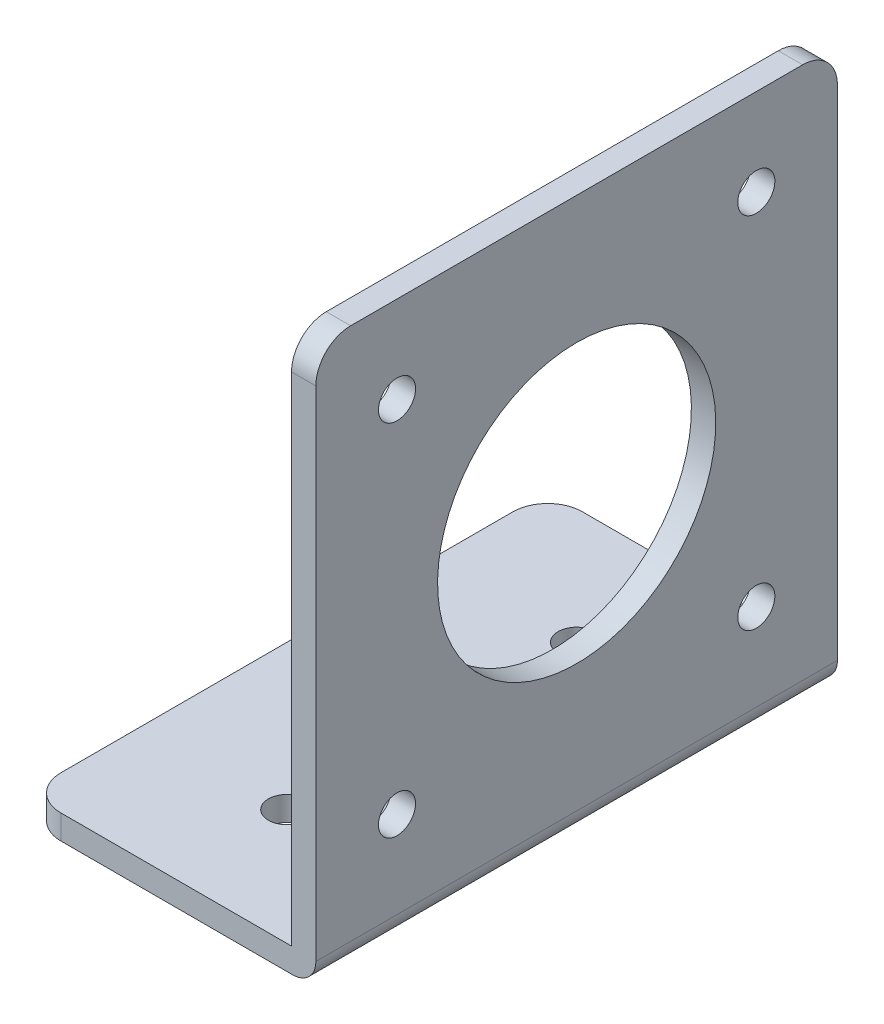
ISO-10303-21;
HEADER;
FILE_DESCRIPTION(('STEP AP214'),'2;1');
FILE_NAME('part.step','',(''),(''),'','','');
FILE_SCHEMA(('AUTOMOTIVE_DESIGN { 1 0 10303 214 1 1 1 1 }'));
ENDSEC;
DATA;
#1=APPLICATION_CONTEXT('core data for automotive mechanical design processes');
#2=APPLICATION_PROTOCOL_DEFINITION('international standard','automotive_design',2000,#1);
#3=PRODUCT_CONTEXT('',#1,'mechanical');
#4=PRODUCT('Part','Part','',(#3));
#5=PRODUCT_RELATED_PRODUCT_CATEGORY('part','',(#4));
#6=PRODUCT_DEFINITION_FORMATION('','',#4);
#7=PRODUCT_DEFINITION_CONTEXT('part definition',#1,'design');
#8=PRODUCT_DEFINITION('design','',#6,#7);
#9=PRODUCT_DEFINITION_SHAPE('','',#8);
#10=(LENGTH_UNIT() NAMED_UNIT(*) SI_UNIT(.MILLI.,.METRE.));
#11=(NAMED_UNIT(*) PLANE_ANGLE_UNIT() SI_UNIT($,.RADIAN.));
#12=(NAMED_UNIT(*) SI_UNIT($,.STERADIAN.) SOLID_ANGLE_UNIT());
#13=UNCERTAINTY_MEASURE_WITH_UNIT(LENGTH_MEASURE(1.E-05),#10,'distance_accuracy_value','');
#14=(GEOMETRIC_REPRESENTATION_CONTEXT(3) GLOBAL_UNCERTAINTY_ASSIGNED_CONTEXT((#13)) GLOBAL_UNIT_ASSIGNED_CONTEXT((#10,
#11,#12)) REPRESENTATION_CONTEXT('',''));
#15=CARTESIAN_POINT('',(0.,0.,0.));
#16=DIRECTION('',(0.,0.,1.));
#17=DIRECTION('',(1.,0.,0.));
#18=AXIS2_PLACEMENT_3D('',#15,#16,#17);
#19=CARTESIAN_POINT('',(2.1,0.,-22.5));
#20=DIRECTION('',(0.,-1.,0.));
#21=DIRECTION('',(0.,0.,-1.));
#22=AXIS2_PLACEMENT_3D('',#19,#20,#21);
#23=PLANE('',#22);
#24=CARTESIAN_POINT('',(-10.4,0.,12.5));
#25=DIRECTION('',(0.,1.,0.));
#26=DIRECTION('',(1.,0.,0.));
#27=AXIS2_PLACEMENT_3D('',#24,#25,#26);
#28=CIRCLE('',#27,1.6);
#29=CARTESIAN_POINT('',(-8.8,0.,12.5));
#30=VERTEX_POINT('',#29);
#31=EDGE_CURVE('E146',#30,#30,#28,.T.);
#32=ORIENTED_EDGE('',*,*,#31,.T.);
#33=EDGE_LOOP('',(#32));
#34=FACE_BOUND('',#33,.T.);
#35=CARTESIAN_POINT('',(-10.4,0.,-12.5));
#36=DIRECTION('',(0.,1.,0.));
#37=DIRECTION('',(1.,0.,0.));
#38=AXIS2_PLACEMENT_3D('',#35,#36,#37);
#39=CIRCLE('',#38,1.6);
#40=CARTESIAN_POINT('',(-8.8,0.,-12.5));
#41=VERTEX_POINT('',#40);
#42=EDGE_CURVE('E145',#41,#41,#39,.T.);
#43=ORIENTED_EDGE('',*,*,#42,.T.);
#44=EDGE_LOOP('',(#43));
#45=FACE_BOUND('',#44,.T.);
#46=DIRECTION('',(0.,0.,-1.));
#47=VECTOR('',#46,1.);
#48=CARTESIAN_POINT('',(-22.9,0.,22.5));
#49=LINE('',#48,#47);
#50=CARTESIAN_POINT('',(-22.9,0.,19.5));
#51=VERTEX_POINT('',#50);
#52=CARTESIAN_POINT('',(-22.9,0.,-19.5));
#53=VERTEX_POINT('',#52);
#54=EDGE_CURVE('E127',#51,#53,#49,.T.);
#55=ORIENTED_EDGE('',*,*,#54,.T.);
#56=CARTESIAN_POINT('',(-19.9,0.,-19.5));
#57=DIRECTION('',(0.,-1.,0.));
#58=DIRECTION('',(0.,0.,-1.));
#59=AXIS2_PLACEMENT_3D('',#56,#57,#58);
#60=CIRCLE('',#59,3.);
#61=CARTESIAN_POINT('',(-19.9,0.,-22.5));
#62=VERTEX_POINT('',#61);
#63=EDGE_CURVE('E354',#53,#62,#60,.T.);
#64=ORIENTED_EDGE('',*,*,#63,.T.);
#65=DIRECTION('',(-1.,0.,0.));
#66=VECTOR('',#65,1.);
#67=CARTESIAN_POINT('',(2.1,0.,-22.5));
#68=LINE('',#67,#66);
#69=CARTESIAN_POINT('',(0.1,0.,-22.5));
#70=VERTEX_POINT('',#69);
#71=EDGE_CURVE('E29',#70,#62,#68,.T.);
#72=ORIENTED_EDGE('',*,*,#71,.F.);
#73=DIRECTION('',(0.,0.,1.));
#74=VECTOR('',#73,1.);
#75=CARTESIAN_POINT('',(0.1,0.,-22.5));
#76=LINE('',#75,#74);
#77=CARTESIAN_POINT('',(0.1,0.,22.5));
#78=VERTEX_POINT('',#77);
#79=EDGE_CURVE('E100',#70,#78,#76,.T.);
#80=ORIENTED_EDGE('',*,*,#79,.T.);
#81=DIRECTION('',(-1.,0.,0.));
#82=VECTOR('',#81,1.);
#83=CARTESIAN_POINT('',(2.1,0.,22.5));
#84=LINE('',#83,#82);
#85=CARTESIAN_POINT('',(-19.9,0.,22.5));
#86=VERTEX_POINT('',#85);
#87=EDGE_CURVE('E12',#78,#86,#84,.T.);
#88=ORIENTED_EDGE('',*,*,#87,.T.);
#89=CARTESIAN_POINT('',(-19.9,0.,19.5));
#90=DIRECTION('',(0.,-1.,0.));
#91=DIRECTION('',(0.,0.,-1.));
#92=AXIS2_PLACEMENT_3D('',#89,#90,#91);
#93=CIRCLE('',#92,3.);
#94=EDGE_CURVE('E370',#86,#51,#93,.T.);
#95=ORIENTED_EDGE('',*,*,#94,.T.);
#96=EDGE_LOOP('',(#55,#64,#72,#80,#88,#95));
#97=FACE_BOUND('',#96,.T.);
#98=ADVANCED_FACE('F20',(#34,#45,#97),#23,.T.);
#99=CARTESIAN_POINT('',(2.1,0.,22.5));
#100=DIRECTION('',(0.,0.,1.));
#101=DIRECTION('',(1.,0.,0.));
#102=AXIS2_PLACEMENT_3D('',#99,#100,#101);
#103=PLANE('',#102);
#104=DIRECTION('',(0.,1.,0.));
#105=VECTOR('',#104,1.);
#106=CARTESIAN_POINT('',(2.1,0.,22.5));
#107=LINE('',#106,#105);
#108=CARTESIAN_POINT('',(2.1,2.,22.5));
#109=VERTEX_POINT('',#108);
#110=CARTESIAN_POINT('',(2.1,45.,22.5));
#111=VERTEX_POINT('',#110);
#112=EDGE_CURVE('E81',#109,#111,#107,.T.);
#113=ORIENTED_EDGE('',*,*,#112,.T.);
#114=DIRECTION('',(-1.,0.,0.));
#115=VECTOR('',#114,1.);
#116=CARTESIAN_POINT('',(2.1,45.,22.5));
#117=LINE('',#116,#115);
#118=CARTESIAN_POINT('',(0.,45.,22.5));
#119=VERTEX_POINT('',#118);
#120=EDGE_CURVE('E293',#111,#119,#117,.T.);
#121=ORIENTED_EDGE('',*,*,#120,.T.);
#122=DIRECTION('',(0.,1.,0.));
#123=VECTOR('',#122,1.);
#124=CARTESIAN_POINT('',(0.,0.,22.5));
#125=LINE('',#124,#123);
#126=CARTESIAN_POINT('',(0.,2.1,22.5));
#127=VERTEX_POINT('',#126);
#128=EDGE_CURVE('E43',#127,#119,#125,.T.);
#129=ORIENTED_EDGE('',*,*,#128,.F.);
#130=DIRECTION('',(-1.,0.,0.));
#131=VECTOR('',#130,1.);
#132=CARTESIAN_POINT('',(2.1,2.1,22.5));
#133=LINE('',#132,#131);
#134=CARTESIAN_POINT('',(-19.9,2.1,22.5));
#135=VERTEX_POINT('',#134);
#136=EDGE_CURVE('E126',#127,#135,#133,.T.);
#137=ORIENTED_EDGE('',*,*,#136,.T.);
#138=DIRECTION('',(0.,-1.,0.));
#139=VECTOR('',#138,1.);
#140=CARTESIAN_POINT('',(-19.9,0.,22.5));
#141=LINE('',#140,#139);
#142=EDGE_CURVE('E95',#135,#86,#141,.T.);
#143=ORIENTED_EDGE('',*,*,#142,.T.);
#144=ORIENTED_EDGE('',*,*,#87,.F.);
#145=CARTESIAN_POINT('',(0.1,2.,22.5));
#146=DIRECTION('',(0.,0.,1.));
#147=DIRECTION('',(1.,0.,0.));
#148=AXIS2_PLACEMENT_3D('',#145,#146,#147);
#149=CIRCLE('',#148,2.);
#150=EDGE_CURVE('E91',#78,#109,#149,.T.);
#151=ORIENTED_EDGE('',*,*,#150,.T.);
#152=EDGE_LOOP('',(#113,#121,#129,#137,#143,#144,#151));
#153=FACE_BOUND('',#152,.T.);
#154=ADVANCED_FACE('F89',(#153),#103,.T.);
#155=CARTESIAN_POINT('',(2.1,48.,22.5));
#156=DIRECTION('',(0.,1.,0.));
#157=DIRECTION('',(1.,0.,0.));
#158=AXIS2_PLACEMENT_3D('',#155,#156,#157);
#159=PLANE('',#158);
#160=DIRECTION('',(0.,0.,-1.));
#161=VECTOR('',#160,1.);
#162=CARTESIAN_POINT('',(0.,48.,22.5));
#163=LINE('',#162,#161);
#164=CARTESIAN_POINT('',(0.,48.,19.5));
#165=VERTEX_POINT('',#164);
#166=CARTESIAN_POINT('',(0.,48.,-19.5));
#167=VERTEX_POINT('',#166);
#168=EDGE_CURVE('E147',#165,#167,#163,.T.);
#169=ORIENTED_EDGE('',*,*,#168,.F.);
#170=DIRECTION('',(1.,0.,0.));
#171=VECTOR('',#170,1.);
#172=CARTESIAN_POINT('',(2.1,48.,19.5));
#173=LINE('',#172,#171);
#174=CARTESIAN_POINT('',(2.1,48.,19.5));
#175=VERTEX_POINT('',#174);
#176=EDGE_CURVE('E282',#165,#175,#173,.T.);
#177=ORIENTED_EDGE('',*,*,#176,.T.);
#178=DIRECTION('',(0.,0.,-1.));
#179=VECTOR('',#178,1.);
#180=CARTESIAN_POINT('',(2.1,48.,22.5));
#181=LINE('',#180,#179);
#182=CARTESIAN_POINT('',(2.1,48.,-19.5));
#183=VERTEX_POINT('',#182);
#184=EDGE_CURVE('E168',#175,#183,#181,.T.);
#185=ORIENTED_EDGE('',*,*,#184,.T.);
#186=DIRECTION('',(-1.,0.,0.));
#187=VECTOR('',#186,1.);
#188=CARTESIAN_POINT('',(2.1,48.,-19.5));
#189=LINE('',#188,#187);
#190=EDGE_CURVE('E295',#183,#167,#189,.T.);
#191=ORIENTED_EDGE('',*,*,#190,.T.);
#192=EDGE_LOOP('',(#169,#177,#185,#191));
#193=FACE_BOUND('',#192,.T.);
#194=ADVANCED_FACE('F283',(#193),#159,.T.);
#195=CARTESIAN_POINT('',(2.1,48.,-22.5));
#196=DIRECTION('',(0.,0.,-1.));
#197=DIRECTION('',(0.,-1.,0.));
#198=AXIS2_PLACEMENT_3D('',#195,#196,#197);
#199=PLANE('',#198);
#200=DIRECTION('',(0.,-1.,0.));
#201=VECTOR('',#200,1.);
#202=CARTESIAN_POINT('',(0.,48.,-22.5));
#203=LINE('',#202,#201);
#204=CARTESIAN_POINT('',(0.,45.,-22.5));
#205=VERTEX_POINT('',#204);
#206=CARTESIAN_POINT('',(0.,2.1,-22.5));
#207=VERTEX_POINT('',#206);
#208=EDGE_CURVE('E199',#205,#207,#203,.T.);
#209=ORIENTED_EDGE('',*,*,#208,.F.);
#210=DIRECTION('',(1.,0.,0.));
#211=VECTOR('',#210,1.);
#212=CARTESIAN_POINT('',(2.1,45.,-22.5));
#213=LINE('',#212,#211);
#214=CARTESIAN_POINT('',(2.1,45.,-22.5));
#215=VERTEX_POINT('',#214);
#216=EDGE_CURVE('E214',#205,#215,#213,.T.);
#217=ORIENTED_EDGE('',*,*,#216,.T.);
#218=DIRECTION('',(0.,-1.,0.));
#219=VECTOR('',#218,1.);
#220=CARTESIAN_POINT('',(2.1,48.,-22.5));
#221=LINE('',#220,#219);
#222=CARTESIAN_POINT('',(2.1,2.,-22.5));
#223=VERTEX_POINT('',#222);
#224=EDGE_CURVE('E167',#215,#223,#221,.T.);
#225=ORIENTED_EDGE('',*,*,#224,.T.);
#226=CARTESIAN_POINT('',(0.1,2.,-22.5));
#227=DIRECTION('',(0.,0.,-1.));
#228=DIRECTION('',(-1.,0.,0.));
#229=AXIS2_PLACEMENT_3D('',#226,#227,#228);
#230=CIRCLE('',#229,2.);
#231=EDGE_CURVE('E117',#223,#70,#230,.T.);
#232=ORIENTED_EDGE('',*,*,#231,.T.);
#233=ORIENTED_EDGE('',*,*,#71,.T.);
#234=DIRECTION('',(0.,1.,0.));
#235=VECTOR('',#234,1.);
#236=CARTESIAN_POINT('',(-19.9,48.,-22.5));
#237=LINE('',#236,#235);
#238=CARTESIAN_POINT('',(-19.9,2.1,-22.5));
#239=VERTEX_POINT('',#238);
#240=EDGE_CURVE('E350',#62,#239,#237,.T.);
#241=ORIENTED_EDGE('',*,*,#240,.T.);
#242=DIRECTION('',(1.,0.,0.));
#243=VECTOR('',#242,1.);
#244=CARTESIAN_POINT('',(-22.9,2.1,-22.5));
#245=LINE('',#244,#243);
#246=EDGE_CURVE('E121',#239,#207,#245,.T.);
#247=ORIENTED_EDGE('',*,*,#246,.T.);
#248=EDGE_LOOP('',(#209,#217,#225,#232,#233,#241,#247));
#249=FACE_BOUND('',#248,.T.);
#250=ADVANCED_FACE('F260',(#249),#199,.T.);
#251=CARTESIAN_POINT('',(2.1,40.5,15.5));
#252=DIRECTION('',(1.,0.,0.));
#253=DIRECTION('',(0.,1.,0.));
#254=AXIS2_PLACEMENT_3D('',#251,#252,#253);
#255=PLANE('',#254);
#256=CARTESIAN_POINT('',(2.1,40.5,15.5));
#257=DIRECTION('',(1.,0.,0.));
#258=DIRECTION('',(0.,1.,0.));
#259=AXIS2_PLACEMENT_3D('',#256,#257,#258);
#260=CIRCLE('',#259,1.6);
#261=CARTESIAN_POINT('',(2.1,42.1,15.5));
#262=VERTEX_POINT('',#261);
#263=EDGE_CURVE('E178',#262,#262,#260,.T.);
#264=ORIENTED_EDGE('',*,*,#263,.F.);
#265=EDGE_LOOP('',(#264));
#266=FACE_BOUND('',#265,.T.);
#267=CARTESIAN_POINT('',(2.1,40.5,-15.5));
#268=DIRECTION('',(1.,0.,0.));
#269=DIRECTION('',(0.,1.,0.));
#270=AXIS2_PLACEMENT_3D('',#267,#268,#269);
#271=CIRCLE('',#270,1.6);
#272=CARTESIAN_POINT('',(2.1,42.1,-15.5));
#273=VERTEX_POINT('',#272);
#274=EDGE_CURVE('E193',#273,#273,#271,.T.);
#275=ORIENTED_EDGE('',*,*,#274,.F.);
#276=EDGE_LOOP('',(#275));
#277=FACE_BOUND('',#276,.T.);
#278=CARTESIAN_POINT('',(2.1,25.,0.));
#279=DIRECTION('',(1.,0.,0.));
#280=DIRECTION('',(0.,1.,0.));
#281=AXIS2_PLACEMENT_3D('',#278,#279,#280);
#282=CIRCLE('',#281,12.);
#283=CARTESIAN_POINT('',(2.1,37.,0.));
#284=VERTEX_POINT('',#283);
#285=EDGE_CURVE('E223',#284,#284,#282,.T.);
#286=ORIENTED_EDGE('',*,*,#285,.F.);
#287=EDGE_LOOP('',(#286));
#288=FACE_BOUND('',#287,.T.);
#289=CARTESIAN_POINT('',(2.1,9.5,15.5));
#290=DIRECTION('',(1.,0.,0.));
#291=DIRECTION('',(0.,1.,0.));
#292=AXIS2_PLACEMENT_3D('',#289,#290,#291);
#293=CIRCLE('',#292,1.6);
#294=CARTESIAN_POINT('',(2.1,11.1,15.5));
#295=VERTEX_POINT('',#294);
#296=EDGE_CURVE('E205',#295,#295,#293,.T.);
#297=ORIENTED_EDGE('',*,*,#296,.F.);
#298=EDGE_LOOP('',(#297));
#299=FACE_BOUND('',#298,.T.);
#300=CARTESIAN_POINT('',(2.1,9.5,-15.5));
#301=DIRECTION('',(1.,0.,0.));
#302=DIRECTION('',(0.,1.,0.));
#303=AXIS2_PLACEMENT_3D('',#300,#301,#302);
#304=CIRCLE('',#303,1.6);
#305=CARTESIAN_POINT('',(2.1,11.1,-15.5));
#306=VERTEX_POINT('',#305);
#307=EDGE_CURVE('E177',#306,#306,#304,.T.);
#308=ORIENTED_EDGE('',*,*,#307,.F.);
#309=EDGE_LOOP('',(#308));
#310=FACE_BOUND('',#309,.T.);
#311=ORIENTED_EDGE('',*,*,#184,.F.);
#312=CARTESIAN_POINT('',(2.1,45.,19.5));
#313=DIRECTION('',(1.,0.,0.));
#314=DIRECTION('',(0.,0.,-1.));
#315=AXIS2_PLACEMENT_3D('',#312,#313,#314);
#316=CIRCLE('',#315,3.);
#317=EDGE_CURVE('E272',#175,#111,#316,.T.);
#318=ORIENTED_EDGE('',*,*,#317,.T.);
#319=ORIENTED_EDGE('',*,*,#112,.F.);
#320=DIRECTION('',(0.,0.,-1.));
#321=VECTOR('',#320,1.);
#322=CARTESIAN_POINT('',(2.1,2.,15.5));
#323=LINE('',#322,#321);
#324=EDGE_CURVE('E111',#109,#223,#323,.T.);
#325=ORIENTED_EDGE('',*,*,#324,.T.);
#326=ORIENTED_EDGE('',*,*,#224,.F.);
#327=CARTESIAN_POINT('',(2.1,45.,-19.5));
#328=DIRECTION('',(1.,0.,0.));
#329=DIRECTION('',(0.,0.,-1.));
#330=AXIS2_PLACEMENT_3D('',#327,#328,#329);
#331=CIRCLE('',#330,3.);
#332=EDGE_CURVE('E219',#215,#183,#331,.T.);
#333=ORIENTED_EDGE('',*,*,#332,.T.);
#334=EDGE_LOOP('',(#311,#318,#319,#325,#326,#333));
#335=FACE_BOUND('',#334,.T.);
#336=ADVANCED_FACE('F256',(#266,#277,#288,#299,#310,#335),#255,.T.);
#337=CARTESIAN_POINT('',(0.,40.5,15.5));
#338=DIRECTION('',(1.,0.,0.));
#339=DIRECTION('',(0.,1.,0.));
#340=AXIS2_PLACEMENT_3D('',#337,#338,#339);
#341=PLANE('',#340);
#342=CARTESIAN_POINT('',(0.,40.5,15.5));
#343=DIRECTION('',(1.,0.,0.));
#344=DIRECTION('',(0.,1.,0.));
#345=AXIS2_PLACEMENT_3D('',#342,#343,#344);
#346=CIRCLE('',#345,1.6);
#347=CARTESIAN_POINT('',(0.,42.1,15.5));
#348=VERTEX_POINT('',#347);
#349=EDGE_CURVE('E172',#348,#348,#346,.T.);
#350=ORIENTED_EDGE('',*,*,#349,.T.);
#351=EDGE_LOOP('',(#350));
#352=FACE_BOUND('',#351,.T.);
#353=CARTESIAN_POINT('',(0.,40.5,-15.5));
#354=DIRECTION('',(1.,0.,0.));
#355=DIRECTION('',(0.,1.,0.));
#356=AXIS2_PLACEMENT_3D('',#353,#354,#355);
#357=CIRCLE('',#356,1.6);
#358=CARTESIAN_POINT('',(0.,42.1,-15.5));
#359=VERTEX_POINT('',#358);
#360=EDGE_CURVE('E188',#359,#359,#357,.T.);
#361=ORIENTED_EDGE('',*,*,#360,.T.);
#362=EDGE_LOOP('',(#361));
#363=FACE_BOUND('',#362,.T.);
#364=CARTESIAN_POINT('',(0.,25.,0.));
#365=DIRECTION('',(1.,0.,0.));
#366=DIRECTION('',(0.,1.,0.));
#367=AXIS2_PLACEMENT_3D('',#364,#365,#366);
#368=CIRCLE('',#367,12.);
#369=CARTESIAN_POINT('',(0.,37.,0.));
#370=VERTEX_POINT('',#369);
#371=EDGE_CURVE('E169',#370,#370,#368,.T.);
#372=ORIENTED_EDGE('',*,*,#371,.T.);
#373=EDGE_LOOP('',(#372));
#374=FACE_BOUND('',#373,.T.);
#375=CARTESIAN_POINT('',(0.,9.5,15.5));
#376=DIRECTION('',(1.,0.,0.));
#377=DIRECTION('',(0.,1.,0.));
#378=AXIS2_PLACEMENT_3D('',#375,#376,#377);
#379=CIRCLE('',#378,1.6);
#380=CARTESIAN_POINT('',(0.,11.1,15.5));
#381=VERTEX_POINT('',#380);
#382=EDGE_CURVE('E211',#381,#381,#379,.T.);
#383=ORIENTED_EDGE('',*,*,#382,.T.);
#384=EDGE_LOOP('',(#383));
#385=FACE_BOUND('',#384,.T.);
#386=CARTESIAN_POINT('',(0.,9.5,-15.5));
#387=DIRECTION('',(1.,0.,0.));
#388=DIRECTION('',(0.,1.,0.));
#389=AXIS2_PLACEMENT_3D('',#386,#387,#388);
#390=CIRCLE('',#389,1.6);
#391=CARTESIAN_POINT('',(0.,11.1,-15.5));
#392=VERTEX_POINT('',#391);
#393=EDGE_CURVE('E198',#392,#392,#390,.T.);
#394=ORIENTED_EDGE('',*,*,#393,.T.);
#395=EDGE_LOOP('',(#394));
#396=FACE_BOUND('',#395,.T.);
#397=ORIENTED_EDGE('',*,*,#128,.T.);
#398=CARTESIAN_POINT('',(0.,45.,19.5));
#399=DIRECTION('',(-1.,0.,0.));
#400=DIRECTION('',(0.,0.,-1.));
#401=AXIS2_PLACEMENT_3D('',#398,#399,#400);
#402=CIRCLE('',#401,3.);
#403=EDGE_CURVE('E289',#119,#165,#402,.T.);
#404=ORIENTED_EDGE('',*,*,#403,.T.);
#405=ORIENTED_EDGE('',*,*,#168,.T.);
#406=CARTESIAN_POINT('',(0.,45.,-19.5));
#407=DIRECTION('',(-1.,0.,0.));
#408=DIRECTION('',(0.,0.,-1.));
#409=AXIS2_PLACEMENT_3D('',#406,#407,#408);
#410=CIRCLE('',#409,3.);
#411=EDGE_CURVE('E218',#167,#205,#410,.T.);
#412=ORIENTED_EDGE('',*,*,#411,.T.);
#413=ORIENTED_EDGE('',*,*,#208,.T.);
#414=DIRECTION('',(0.,0.,1.));
#415=VECTOR('',#414,1.);
#416=CARTESIAN_POINT('',(0.,2.1,15.5));
#417=LINE('',#416,#415);
#418=EDGE_CURVE('E845',#207,#127,#417,.T.);
#419=ORIENTED_EDGE('',*,*,#418,.T.);
#420=EDGE_LOOP('',(#397,#404,#405,#412,#413,#419));
#421=FACE_BOUND('',#420,.T.);
#422=ADVANCED_FACE('F259',(#352,#363,#374,#385,#396,#421),#341,.F.);
#423=CARTESIAN_POINT('',(-10.4,2.1,12.5));
#424=DIRECTION('',(0.,1.,0.));
#425=DIRECTION('',(1.,0.,0.));
#426=AXIS2_PLACEMENT_3D('',#423,#424,#425);
#427=PLANE('',#426);
#428=CARTESIAN_POINT('',(-10.4,2.1,-12.5));
#429=DIRECTION('',(0.,1.,0.));
#430=DIRECTION('',(1.,0.,0.));
#431=AXIS2_PLACEMENT_3D('',#428,#429,#430);
#432=CIRCLE('',#431,1.6);
#433=CARTESIAN_POINT('',(-8.8,2.1,-12.5));
#434=VERTEX_POINT('',#433);
#435=EDGE_CURVE('E139',#434,#434,#432,.T.);
#436=ORIENTED_EDGE('',*,*,#435,.F.);
#437=EDGE_LOOP('',(#436));
#438=FACE_BOUND('',#437,.T.);
#439=CARTESIAN_POINT('',(-10.4,2.1,12.5));
#440=DIRECTION('',(0.,1.,0.));
#441=DIRECTION('',(1.,0.,0.));
#442=AXIS2_PLACEMENT_3D('',#439,#440,#441);
#443=CIRCLE('',#442,1.6);
#444=CARTESIAN_POINT('',(-8.8,2.1,12.5));
#445=VERTEX_POINT('',#444);
#446=EDGE_CURVE('E224',#445,#445,#443,.T.);
#447=ORIENTED_EDGE('',*,*,#446,.F.);
#448=EDGE_LOOP('',(#447));
#449=FACE_BOUND('',#448,.T.);
#450=ORIENTED_EDGE('',*,*,#246,.F.);
#451=CARTESIAN_POINT('',(-19.9,2.1,-19.5));
#452=DIRECTION('',(0.,1.,0.));
#453=DIRECTION('',(0.,0.,1.));
#454=AXIS2_PLACEMENT_3D('',#451,#452,#453);
#455=CIRCLE('',#454,3.);
#456=CARTESIAN_POINT('',(-22.9,2.1,-19.5));
#457=VERTEX_POINT('',#456);
#458=EDGE_CURVE('E362',#239,#457,#455,.T.);
#459=ORIENTED_EDGE('',*,*,#458,.T.);
#460=DIRECTION('',(0.,0.,-1.));
#461=VECTOR('',#460,1.);
#462=CARTESIAN_POINT('',(-22.9,2.1,22.5));
#463=LINE('',#462,#461);
#464=CARTESIAN_POINT('',(-22.9,2.1,19.5));
#465=VERTEX_POINT('',#464);
#466=EDGE_CURVE('E108',#465,#457,#463,.T.);
#467=ORIENTED_EDGE('',*,*,#466,.F.);
#468=CARTESIAN_POINT('',(-19.9,2.1,19.5));
#469=DIRECTION('',(0.,1.,0.));
#470=DIRECTION('',(0.,0.,1.));
#471=AXIS2_PLACEMENT_3D('',#468,#469,#470);
#472=CIRCLE('',#471,3.);
#473=EDGE_CURVE('E153',#465,#135,#472,.T.);
#474=ORIENTED_EDGE('',*,*,#473,.T.);
#475=ORIENTED_EDGE('',*,*,#136,.F.);
#476=ORIENTED_EDGE('',*,*,#418,.F.);
#477=EDGE_LOOP('',(#450,#459,#467,#474,#475,#476));
#478=FACE_BOUND('',#477,.T.);
#479=ADVANCED_FACE('F387',(#438,#449,#478),#427,.T.);
#480=CARTESIAN_POINT('',(-22.9,2.1,22.5));
#481=DIRECTION('',(-1.,0.,0.));
#482=DIRECTION('',(0.,1.,0.));
#483=AXIS2_PLACEMENT_3D('',#480,#481,#482);
#484=PLANE('',#483);
#485=ORIENTED_EDGE('',*,*,#466,.T.);
#486=DIRECTION('',(0.,-1.,0.));
#487=VECTOR('',#486,1.);
#488=CARTESIAN_POINT('',(-22.9,2.1,-19.5));
#489=LINE('',#488,#487);
#490=EDGE_CURVE('E311',#457,#53,#489,.T.);
#491=ORIENTED_EDGE('',*,*,#490,.T.);
#492=ORIENTED_EDGE('',*,*,#54,.F.);
#493=DIRECTION('',(0.,1.,0.));
#494=VECTOR('',#493,1.);
#495=CARTESIAN_POINT('',(-22.9,2.1,19.5));
#496=LINE('',#495,#494);
#497=EDGE_CURVE('E212',#51,#465,#496,.T.);
#498=ORIENTED_EDGE('',*,*,#497,.T.);
#499=EDGE_LOOP('',(#485,#491,#492,#498));
#500=FACE_BOUND('',#499,.T.);
#501=ADVANCED_FACE('F931',(#500),#484,.T.);
#502=CARTESIAN_POINT('',(0.1,2.,-22.5));
#503=DIRECTION('',(0.,0.,1.));
#504=DIRECTION('',(1.,0.,0.));
#505=AXIS2_PLACEMENT_3D('',#502,#503,#504);
#506=CYLINDRICAL_SURFACE('',#505,2.);
#507=ORIENTED_EDGE('',*,*,#231,.F.);
#508=ORIENTED_EDGE('',*,*,#324,.F.);
#509=ORIENTED_EDGE('',*,*,#150,.F.);
#510=ORIENTED_EDGE('',*,*,#79,.F.);
#511=EDGE_LOOP('',(#507,#508,#509,#510));
#512=FACE_BOUND('',#511,.T.);
#513=ADVANCED_FACE('F110',(#512),#506,.T.);
#514=CARTESIAN_POINT('',(2.1,45.,19.5));
#515=DIRECTION('',(-1.,0.,0.));
#516=DIRECTION('',(0.,0.,1.));
#517=AXIS2_PLACEMENT_3D('',#514,#515,#516);
#518=CYLINDRICAL_SURFACE('',#517,3.);
#519=ORIENTED_EDGE('',*,*,#317,.F.);
#520=ORIENTED_EDGE('',*,*,#176,.F.);
#521=ORIENTED_EDGE('',*,*,#403,.F.);
#522=ORIENTED_EDGE('',*,*,#120,.F.);
#523=EDGE_LOOP('',(#519,#520,#521,#522));
#524=FACE_BOUND('',#523,.T.);
#525=ADVANCED_FACE('F292',(#524),#518,.T.);
#526=CARTESIAN_POINT('',(2.1,45.,-19.5));
#527=DIRECTION('',(-1.,0.,0.));
#528=DIRECTION('',(0.,0.,1.));
#529=AXIS2_PLACEMENT_3D('',#526,#527,#528);
#530=CYLINDRICAL_SURFACE('',#529,3.);
#531=ORIENTED_EDGE('',*,*,#332,.F.);
#532=ORIENTED_EDGE('',*,*,#216,.F.);
#533=ORIENTED_EDGE('',*,*,#411,.F.);
#534=ORIENTED_EDGE('',*,*,#190,.F.);
#535=EDGE_LOOP('',(#531,#532,#533,#534));
#536=FACE_BOUND('',#535,.T.);
#537=ADVANCED_FACE('F321',(#536),#530,.T.);
#538=CARTESIAN_POINT('',(-19.9,2.1,-19.5));
#539=DIRECTION('',(0.,-1.,0.));
#540=DIRECTION('',(0.,0.,-1.));
#541=AXIS2_PLACEMENT_3D('',#538,#539,#540);
#542=CYLINDRICAL_SURFACE('',#541,3.);
#543=ORIENTED_EDGE('',*,*,#458,.F.);
#544=ORIENTED_EDGE('',*,*,#240,.F.);
#545=ORIENTED_EDGE('',*,*,#63,.F.);
#546=ORIENTED_EDGE('',*,*,#490,.F.);
#547=EDGE_LOOP('',(#543,#544,#545,#546));
#548=FACE_BOUND('',#547,.T.);
#549=ADVANCED_FACE('F360',(#548),#542,.T.);
#550=CARTESIAN_POINT('',(-19.9,0.,19.5));
#551=DIRECTION('',(0.,-1.,0.));
#552=DIRECTION('',(0.,0.,-1.));
#553=AXIS2_PLACEMENT_3D('',#550,#551,#552);
#554=CYLINDRICAL_SURFACE('',#553,3.);
#555=ORIENTED_EDGE('',*,*,#473,.F.);
#556=ORIENTED_EDGE('',*,*,#497,.F.);
#557=ORIENTED_EDGE('',*,*,#94,.F.);
#558=ORIENTED_EDGE('',*,*,#142,.F.);
#559=EDGE_LOOP('',(#555,#556,#557,#558));
#560=FACE_BOUND('',#559,.T.);
#561=ADVANCED_FACE('F390',(#560),#554,.T.);
#562=CARTESIAN_POINT('',(-10.4,2.1,-12.5));
#563=DIRECTION('',(0.,-1.,0.));
#564=DIRECTION('',(0.,0.,-1.));
#565=AXIS2_PLACEMENT_3D('',#562,#563,#564);
#566=CYLINDRICAL_SURFACE('',#565,1.6);
#567=ORIENTED_EDGE('',*,*,#42,.F.);
#568=EDGE_LOOP('',(#567));
#569=FACE_BOUND('',#568,.T.);
#570=ORIENTED_EDGE('',*,*,#435,.T.);
#571=EDGE_LOOP('',(#570));
#572=FACE_BOUND('',#571,.T.);
#573=ADVANCED_FACE('F474',(#569,#572),#566,.F.);
#574=CARTESIAN_POINT('',(-10.4,2.1,12.5));
#575=DIRECTION('',(0.,-1.,0.));
#576=DIRECTION('',(0.,0.,-1.));
#577=AXIS2_PLACEMENT_3D('',#574,#575,#576);
#578=CYLINDRICAL_SURFACE('',#577,1.6);
#579=ORIENTED_EDGE('',*,*,#31,.F.);
#580=EDGE_LOOP('',(#579));
#581=FACE_BOUND('',#580,.T.);
#582=ORIENTED_EDGE('',*,*,#446,.T.);
#583=EDGE_LOOP('',(#582));
#584=FACE_BOUND('',#583,.T.);
#585=ADVANCED_FACE('F480',(#581,#584),#578,.F.);
#586=CARTESIAN_POINT('',(2.1,9.5,-15.5));
#587=DIRECTION('',(-1.,0.,0.));
#588=DIRECTION('',(0.,0.,1.));
#589=AXIS2_PLACEMENT_3D('',#586,#587,#588);
#590=CYLINDRICAL_SURFACE('',#589,1.6);
#591=ORIENTED_EDGE('',*,*,#393,.F.);
#592=EDGE_LOOP('',(#591));
#593=FACE_BOUND('',#592,.T.);
#594=ORIENTED_EDGE('',*,*,#307,.T.);
#595=EDGE_LOOP('',(#594));
#596=FACE_BOUND('',#595,.T.);
#597=ADVANCED_FACE('F496',(#593,#596),#590,.F.);
#598=CARTESIAN_POINT('',(2.1,40.5,15.5));
#599=DIRECTION('',(-1.,0.,0.));
#600=DIRECTION('',(0.,0.,1.));
#601=AXIS2_PLACEMENT_3D('',#598,#599,#600);
#602=CYLINDRICAL_SURFACE('',#601,1.6);
#603=ORIENTED_EDGE('',*,*,#349,.F.);
#604=EDGE_LOOP('',(#603));
#605=FACE_BOUND('',#604,.T.);
#606=ORIENTED_EDGE('',*,*,#263,.T.);
#607=EDGE_LOOP('',(#606));
#608=FACE_BOUND('',#607,.T.);
#609=ADVANCED_FACE('F254',(#605,#608),#602,.F.);
#610=CARTESIAN_POINT('',(2.1,40.5,-15.5));
#611=DIRECTION('',(-1.,0.,0.));
#612=DIRECTION('',(0.,0.,1.));
#613=AXIS2_PLACEMENT_3D('',#610,#611,#612);
#614=CYLINDRICAL_SURFACE('',#613,1.6);
#615=ORIENTED_EDGE('',*,*,#360,.F.);
#616=EDGE_LOOP('',(#615));
#617=FACE_BOUND('',#616,.T.);
#618=ORIENTED_EDGE('',*,*,#274,.T.);
#619=EDGE_LOOP('',(#618));
#620=FACE_BOUND('',#619,.T.);
#621=ADVANCED_FACE('F521',(#617,#620),#614,.F.);
#622=CARTESIAN_POINT('',(2.1,25.,0.));
#623=DIRECTION('',(-1.,0.,0.));
#624=DIRECTION('',(0.,0.,1.));
#625=AXIS2_PLACEMENT_3D('',#622,#623,#624);
#626=CYLINDRICAL_SURFACE('',#625,12.);
#627=ORIENTED_EDGE('',*,*,#371,.F.);
#628=EDGE_LOOP('',(#627));
#629=FACE_BOUND('',#628,.T.);
#630=ORIENTED_EDGE('',*,*,#285,.T.);
#631=EDGE_LOOP('',(#630));
#632=FACE_BOUND('',#631,.T.);
#633=ADVANCED_FACE('F534',(#629,#632),#626,.F.);
#634=CARTESIAN_POINT('',(2.1,9.5,15.5));
#635=DIRECTION('',(-1.,0.,0.));
#636=DIRECTION('',(0.,0.,1.));
#637=AXIS2_PLACEMENT_3D('',#634,#635,#636);
#638=CYLINDRICAL_SURFACE('',#637,1.6);
#639=ORIENTED_EDGE('',*,*,#382,.F.);
#640=EDGE_LOOP('',(#639));
#641=FACE_BOUND('',#640,.T.);
#642=ORIENTED_EDGE('',*,*,#296,.T.);
#643=EDGE_LOOP('',(#642));
#644=FACE_BOUND('',#643,.T.);
#645=ADVANCED_FACE('F548',(#641,#644),#638,.F.);
#646=CLOSED_SHELL('',(#98,#154,#194,#250,#336,#422,#479,#501,#513,#525,#537,#549,#561,#573,#585,
#597,#609,#621,#633,#645));
#647=MANIFOLD_SOLID_BREP('B1',#646);
#648=ADVANCED_BREP_SHAPE_REPRESENTATION('',(#18,#647),#14);
#649=SHAPE_DEFINITION_REPRESENTATION(#9,#648);
ENDSEC;
END-ISO-10303-21;
